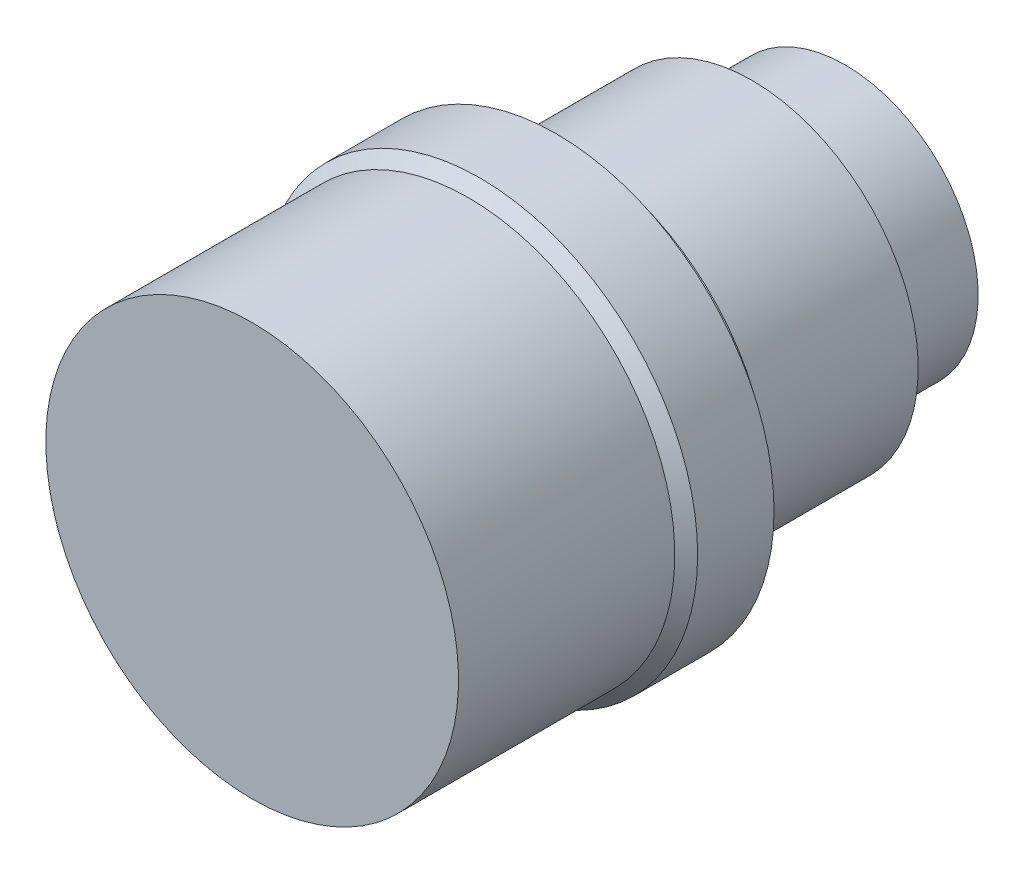
ISO-10303-21;
HEADER;
FILE_DESCRIPTION(('STEP AP214'),'2;1');
FILE_NAME('part.step','',(''),(''),'','','');
FILE_SCHEMA(('AUTOMOTIVE_DESIGN { 1 0 10303 214 1 1 1 1 }'));
ENDSEC;
DATA;
#1=APPLICATION_CONTEXT('core data for automotive mechanical design processes');
#2=APPLICATION_PROTOCOL_DEFINITION('international standard','automotive_design',2000,#1);
#3=PRODUCT_CONTEXT('',#1,'mechanical');
#4=PRODUCT('Part','Part','',(#3));
#5=PRODUCT_RELATED_PRODUCT_CATEGORY('part','',(#4));
#6=PRODUCT_DEFINITION_FORMATION('','',#4);
#7=PRODUCT_DEFINITION_CONTEXT('part definition',#1,'design');
#8=PRODUCT_DEFINITION('design','',#6,#7);
#9=PRODUCT_DEFINITION_SHAPE('','',#8);
#10=(LENGTH_UNIT() NAMED_UNIT(*) SI_UNIT(.MILLI.,.METRE.));
#11=(NAMED_UNIT(*) PLANE_ANGLE_UNIT() SI_UNIT($,.RADIAN.));
#12=(NAMED_UNIT(*) SI_UNIT($,.STERADIAN.) SOLID_ANGLE_UNIT());
#13=UNCERTAINTY_MEASURE_WITH_UNIT(LENGTH_MEASURE(1.E-05),#10,'distance_accuracy_value','');
#14=(GEOMETRIC_REPRESENTATION_CONTEXT(3) GLOBAL_UNCERTAINTY_ASSIGNED_CONTEXT((#13)) GLOBAL_UNIT_ASSIGNED_CONTEXT((#10,
#11,#12)) REPRESENTATION_CONTEXT('',''));
#15=CARTESIAN_POINT('',(0.,0.,0.));
#16=DIRECTION('',(0.,0.,1.));
#17=DIRECTION('',(1.,0.,0.));
#18=AXIS2_PLACEMENT_3D('',#15,#16,#17);
#19=CARTESIAN_POINT('',(-2.70726328508919,-1.04987604220185E-06,1.47954483537407));
#20=DIRECTION('',(0.,0.,1.));
#21=DIRECTION('',(0.,-1.,0.));
#22=AXIS2_PLACEMENT_3D('',#19,#20,#21);
#23=PLANE('',#22);
#24=CARTESIAN_POINT('',(-2.70726328508919,-1.04987604220185E-06,1.47954483537407));
#25=DIRECTION('',(0.,0.,-1.));
#26=DIRECTION('',(0.,1.,0.));
#27=AXIS2_PLACEMENT_3D('',#24,#25,#26);
#28=CIRCLE('',#27,8.69992423010511);
#29=CARTESIAN_POINT('',(-2.70726328508919,8.69992318022907,1.47954483537407));
#30=VERTEX_POINT('',#29);
#31=EDGE_CURVE('E17',#30,#30,#28,.F.);
#32=ORIENTED_EDGE('',*,*,#31,.F.);
#33=EDGE_LOOP('',(#32));
#34=FACE_BOUND('',#33,.T.);
#35=ADVANCED_FACE('F14',(#34),#23,.F.);
#36=CARTESIAN_POINT('',(-2.70726328508919,-1.04987604104455E-06,20.3803071052914));
#37=DIRECTION('',(0.,0.,-1.));
#38=DIRECTION('',(0.,1.,0.));
#39=AXIS2_PLACEMENT_3D('',#36,#37,#38);
#40=CYLINDRICAL_SURFACE('',#39,8.69992423010511);
#41=ORIENTED_EDGE('',*,*,#31,.T.);
#42=EDGE_LOOP('',(#41));
#43=FACE_BOUND('',#42,.T.);
#44=CARTESIAN_POINT('',(-2.70726328508919,-1.04987604182834E-06,7.57955303193882));
#45=DIRECTION('',(0.,0.,-1.));
#46=DIRECTION('',(0.,1.,0.));
#47=AXIS2_PLACEMENT_3D('',#44,#45,#46);
#48=CIRCLE('',#47,8.69992423010511);
#49=CARTESIAN_POINT('',(-2.70726328508919,8.69992318022907,7.57955303193882));
#50=VERTEX_POINT('',#49);
#51=EDGE_CURVE('E45',#50,#50,#48,.T.);
#52=ORIENTED_EDGE('',*,*,#51,.T.);
#53=EDGE_LOOP('',(#52));
#54=FACE_BOUND('',#53,.T.);
#55=ADVANCED_FACE('F52',(#43,#54),#40,.T.);
#56=CARTESIAN_POINT('',(-2.70726328508919,8.69992318022907,7.57955303193882));
#57=DIRECTION('',(0.,0.,1.));
#58=DIRECTION('',(0.,-1.,0.));
#59=AXIS2_PLACEMENT_3D('',#56,#57,#58);
#60=PLANE('',#59);
#61=ORIENTED_EDGE('',*,*,#51,.F.);
#62=EDGE_LOOP('',(#61));
#63=FACE_BOUND('',#62,.T.);
#64=CARTESIAN_POINT('',(-2.70726328508919,-1.04987604182834E-06,7.57955303193882));
#65=DIRECTION('',(0.,0.,-1.));
#66=DIRECTION('',(0.,1.,0.));
#67=AXIS2_PLACEMENT_3D('',#64,#65,#66);
#68=CIRCLE('',#67,10.8750963082252);
#69=CARTESIAN_POINT('',(-2.70726328508919,10.8750952583492,7.57955303193882));
#70=VERTEX_POINT('',#69);
#71=EDGE_CURVE('E43',#70,#70,#68,.F.);
#72=ORIENTED_EDGE('',*,*,#71,.F.);
#73=EDGE_LOOP('',(#72));
#74=FACE_BOUND('',#73,.T.);
#75=ADVANCED_FACE('F59',(#63,#74),#60,.F.);
#76=CARTESIAN_POINT('',(-2.70726328508919,-1.04987604104455E-06,20.3803071052914));
#77=DIRECTION('',(0.,0.,-1.));
#78=DIRECTION('',(0.,1.,0.));
#79=AXIS2_PLACEMENT_3D('',#76,#77,#78);
#80=CYLINDRICAL_SURFACE('',#79,10.8750963082252);
#81=ORIENTED_EDGE('',*,*,#71,.T.);
#82=EDGE_LOOP('',(#81));
#83=FACE_BOUND('',#82,.T.);
#84=CARTESIAN_POINT('',(-2.70726328508919,-1.04987604112113E-06,19.1296778097634));
#85=DIRECTION('',(0.,0.,-1.));
#86=DIRECTION('',(0.,1.,0.));
#87=AXIS2_PLACEMENT_3D('',#84,#85,#86);
#88=CIRCLE('',#87,10.8750963082252);
#89=CARTESIAN_POINT('',(-2.70726328508919,10.8750952583492,19.1296778097634));
#90=VERTEX_POINT('',#89);
#91=EDGE_CURVE('E40',#90,#90,#88,.T.);
#92=ORIENTED_EDGE('',*,*,#91,.T.);
#93=EDGE_LOOP('',(#92));
#94=FACE_BOUND('',#93,.T.);
#95=ADVANCED_FACE('F90',(#83,#94),#80,.T.);
#96=CARTESIAN_POINT('',(-2.70726328508919,10.8750952583491,19.1296778097634));
#97=DIRECTION('',(0.,0.,1.));
#98=DIRECTION('',(0.,-1.,0.));
#99=AXIS2_PLACEMENT_3D('',#96,#97,#98);
#100=PLANE('',#99);
#101=ORIENTED_EDGE('',*,*,#91,.F.);
#102=EDGE_LOOP('',(#101));
#103=FACE_BOUND('',#102,.T.);
#104=CARTESIAN_POINT('',(-2.70726328508919,-1.04987604112113E-06,19.1296778097634));
#105=DIRECTION('',(0.,0.,-1.));
#106=DIRECTION('',(0.,1.,0.));
#107=AXIS2_PLACEMENT_3D('',#104,#105,#106);
#108=CIRCLE('',#107,12.5995512917137);
#109=CARTESIAN_POINT('',(-2.70726328508919,12.5995502418377,19.1296778097634));
#110=VERTEX_POINT('',#109);
#111=EDGE_CURVE('E37',#110,#110,#108,.F.);
#112=ORIENTED_EDGE('',*,*,#111,.F.);
#113=EDGE_LOOP('',(#112));
#114=FACE_BOUND('',#113,.T.);
#115=ADVANCED_FACE('F86',(#103,#114),#100,.F.);
#116=CARTESIAN_POINT('',(-2.70726328508919,-1.04987604104455E-06,20.3803071052914));
#117=DIRECTION('',(0.,0.,-1.));
#118=DIRECTION('',(0.,1.,0.));
#119=AXIS2_PLACEMENT_3D('',#116,#117,#118);
#120=CYLINDRICAL_SURFACE('',#119,12.5995512917137);
#121=ORIENTED_EDGE('',*,*,#111,.T.);
#122=EDGE_LOOP('',(#121));
#123=FACE_BOUND('',#122,.T.);
#124=CARTESIAN_POINT('',(-2.70726328508919,-1.04987604104455E-06,20.3803071052914));
#125=DIRECTION('',(0.,0.,-1.));
#126=DIRECTION('',(0.,1.,0.));
#127=AXIS2_PLACEMENT_3D('',#124,#125,#126);
#128=CIRCLE('',#127,12.5995512917137);
#129=CARTESIAN_POINT('',(-2.70726328508919,12.5995502418377,20.3803071052914));
#130=VERTEX_POINT('',#129);
#131=EDGE_CURVE('E34',#130,#130,#128,.T.);
#132=ORIENTED_EDGE('',*,*,#131,.T.);
#133=EDGE_LOOP('',(#132));
#134=FACE_BOUND('',#133,.T.);
#135=ADVANCED_FACE('F82',(#123,#134),#120,.T.);
#136=CARTESIAN_POINT('',(-2.70726328508919,12.5995502418377,20.3803071052914));
#137=DIRECTION('',(0.,0.,1.));
#138=DIRECTION('',(0.,-1.,0.));
#139=AXIS2_PLACEMENT_3D('',#136,#137,#138);
#140=PLANE('',#139);
#141=ORIENTED_EDGE('',*,*,#131,.F.);
#142=EDGE_LOOP('',(#141));
#143=FACE_BOUND('',#142,.T.);
#144=CARTESIAN_POINT('',(-2.70726328508919,-1.04987604104455E-06,20.3803071052914));
#145=DIRECTION('',(0.,0.,-1.));
#146=DIRECTION('',(0.,1.,0.));
#147=AXIS2_PLACEMENT_3D('',#144,#145,#146);
#148=CIRCLE('',#147,14.2452969129341);
#149=CARTESIAN_POINT('',(-2.70726328508919,14.2452958630581,20.3803071052914));
#150=VERTEX_POINT('',#149);
#151=EDGE_CURVE('E30',#150,#150,#148,.F.);
#152=ORIENTED_EDGE('',*,*,#151,.F.);
#153=EDGE_LOOP('',(#152));
#154=FACE_BOUND('',#153,.T.);
#155=ADVANCED_FACE('F78',(#143,#154),#140,.F.);
#156=CARTESIAN_POINT('',(-2.70726328508919,-1.04987604104455E-06,20.3803071052914));
#157=DIRECTION('',(0.,0.,-1.));
#158=DIRECTION('',(0.,1.,0.));
#159=AXIS2_PLACEMENT_3D('',#156,#157,#158);
#160=CYLINDRICAL_SURFACE('',#159,14.2452969129341);
#161=CARTESIAN_POINT('',(-2.70726328508919,-1.04987604073842E-06,25.3799148967884));
#162=DIRECTION('',(0.,0.,-1.));
#163=DIRECTION('',(-1.,0.,0.));
#164=AXIS2_PLACEMENT_3D('',#161,#162,#163);
#165=CIRCLE('',#164,14.2452969129341);
#166=CARTESIAN_POINT('',(-16.9525601980233,-1.04987603986618E-06,25.3799148967884));
#167=VERTEX_POINT('',#166);
#168=EDGE_CURVE('E26',#167,#167,#165,.F.);
#169=ORIENTED_EDGE('',*,*,#168,.F.);
#170=EDGE_LOOP('',(#169));
#171=FACE_BOUND('',#170,.T.);
#172=ORIENTED_EDGE('',*,*,#151,.T.);
#173=EDGE_LOOP('',(#172));
#174=FACE_BOUND('',#173,.T.);
#175=ADVANCED_FACE('F74',(#171,#174),#160,.T.);
#176=CARTESIAN_POINT('',(-2.70726328508919,13.4997284710364,40.2799999999986));
#177=DIRECTION('',(0.,0.,-1.));
#178=DIRECTION('',(0.,1.,0.));
#179=AXIS2_PLACEMENT_3D('',#176,#177,#178);
#180=PLANE('',#179);
#181=CARTESIAN_POINT('',(-2.70726328508919,-1.04987603982609E-06,40.2799999999986));
#182=DIRECTION('',(0.,0.,-1.));
#183=DIRECTION('',(0.,1.,0.));
#184=AXIS2_PLACEMENT_3D('',#181,#182,#183);
#185=CIRCLE('',#184,13.4997295209124);
#186=CARTESIAN_POINT('',(-2.70726328508919,13.4997284710364,40.2799999999986));
#187=VERTEX_POINT('',#186);
#188=EDGE_CURVE('E21',#187,#187,#185,.T.);
#189=ORIENTED_EDGE('',*,*,#188,.F.);
#190=EDGE_LOOP('',(#189));
#191=FACE_BOUND('',#190,.T.);
#192=ADVANCED_FACE('F68',(#191),#180,.F.);
#193=CARTESIAN_POINT('',(-2.70726328508919,-1.04987604073842E-06,25.3799148967884));
#194=DIRECTION('',(0.,0.,-1.));
#195=DIRECTION('',(0.,1.,0.));
#196=AXIS2_PLACEMENT_3D('',#193,#194,#195);
#197=CONICAL_SURFACE('',#196,14.2452969129341,0.78244439831166);
#198=CARTESIAN_POINT('',(-2.70726328508919,-1.0498760406925E-06,26.1298998118459));
#199=DIRECTION('',(0.,0.,-1.));
#200=DIRECTION('',(0.,1.,0.));
#201=AXIS2_PLACEMENT_3D('',#198,#199,#200);
#202=CIRCLE('',#201,13.4997295209124);
#203=CARTESIAN_POINT('',(-2.70726328508919,13.4997284710364,26.1298998118459));
#204=VERTEX_POINT('',#203);
#205=EDGE_CURVE('E10',#204,#204,#202,.F.);
#206=ORIENTED_EDGE('',*,*,#205,.F.);
#207=EDGE_LOOP('',(#206));
#208=FACE_BOUND('',#207,.T.);
#209=ORIENTED_EDGE('',*,*,#168,.T.);
#210=EDGE_LOOP('',(#209));
#211=FACE_BOUND('',#210,.T.);
#212=ADVANCED_FACE('F62',(#208,#211),#197,.T.);
#213=CARTESIAN_POINT('',(-2.70726328508919,-1.04987604104455E-06,20.3803071052914));
#214=DIRECTION('',(0.,0.,-1.));
#215=DIRECTION('',(0.,1.,0.));
#216=AXIS2_PLACEMENT_3D('',#213,#214,#215);
#217=CYLINDRICAL_SURFACE('',#216,13.4997295209124);
#218=ORIENTED_EDGE('',*,*,#188,.T.);
#219=EDGE_LOOP('',(#218));
#220=FACE_BOUND('',#219,.T.);
#221=ORIENTED_EDGE('',*,*,#205,.T.);
#222=EDGE_LOOP('',(#221));
#223=FACE_BOUND('',#222,.T.);
#224=ADVANCED_FACE('F60',(#220,#223),#217,.T.);
#225=CLOSED_SHELL('',(#35,#55,#75,#95,#115,#135,#155,#175,#192,#212,#224));
#226=MANIFOLD_SOLID_BREP('B1',#225);
#227=ADVANCED_BREP_SHAPE_REPRESENTATION('',(#18,#226),#14);
#228=SHAPE_DEFINITION_REPRESENTATION(#9,#227);
ENDSEC;
END-ISO-10303-21;
